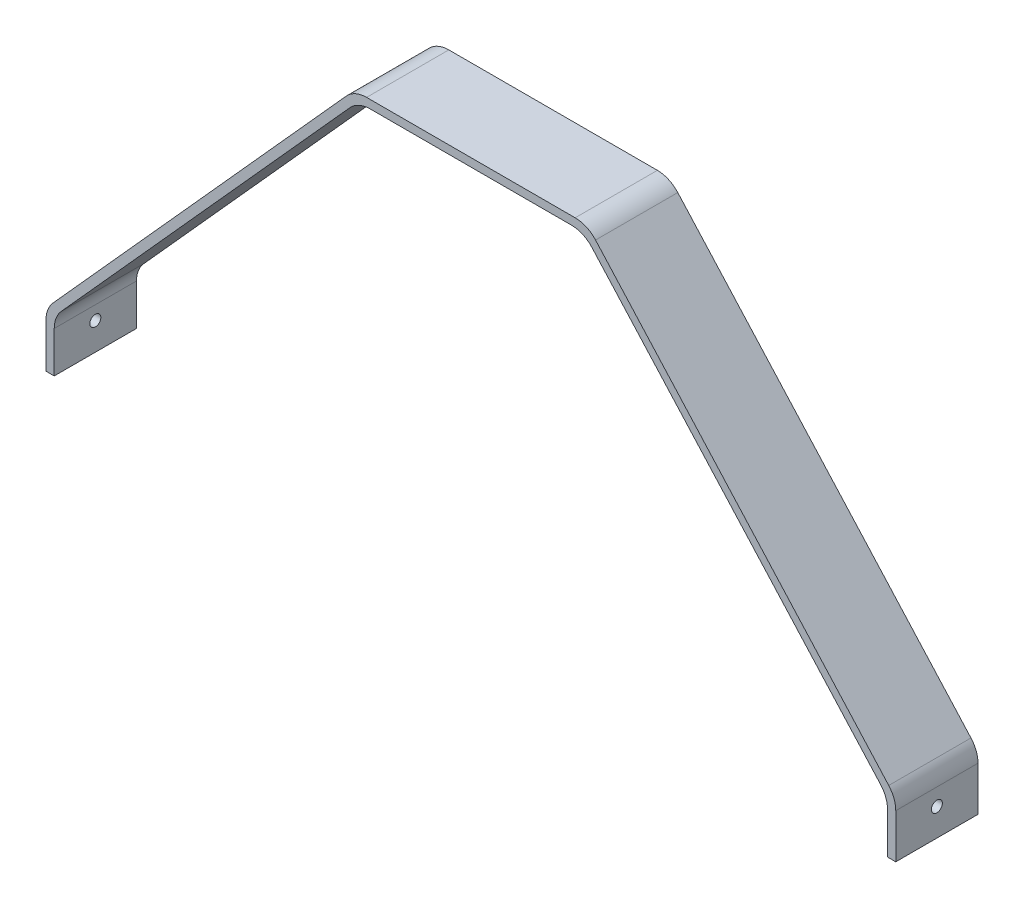
ISO-10303-21;
HEADER;
FILE_DESCRIPTION(('STEP AP214'),'2;1');
FILE_NAME('part.step','',(''),(''),'','','');
FILE_SCHEMA(('AUTOMOTIVE_DESIGN { 1 0 10303 214 1 1 1 1 }'));
ENDSEC;
DATA;
#1=APPLICATION_CONTEXT('core data for automotive mechanical design processes');
#2=APPLICATION_PROTOCOL_DEFINITION('international standard','automotive_design',2000,#1);
#3=PRODUCT_CONTEXT('',#1,'mechanical');
#4=PRODUCT('Part','Part','',(#3));
#5=PRODUCT_RELATED_PRODUCT_CATEGORY('part','',(#4));
#6=PRODUCT_DEFINITION_FORMATION('','',#4);
#7=PRODUCT_DEFINITION_CONTEXT('part definition',#1,'design');
#8=PRODUCT_DEFINITION('design','',#6,#7);
#9=PRODUCT_DEFINITION_SHAPE('','',#8);
#10=(LENGTH_UNIT() NAMED_UNIT(*) SI_UNIT(.MILLI.,.METRE.));
#11=(NAMED_UNIT(*) PLANE_ANGLE_UNIT() SI_UNIT($,.RADIAN.));
#12=(NAMED_UNIT(*) SI_UNIT($,.STERADIAN.) SOLID_ANGLE_UNIT());
#13=UNCERTAINTY_MEASURE_WITH_UNIT(LENGTH_MEASURE(1.E-05),#10,'distance_accuracy_value','');
#14=(GEOMETRIC_REPRESENTATION_CONTEXT(3) GLOBAL_UNCERTAINTY_ASSIGNED_CONTEXT((#13)) GLOBAL_UNIT_ASSIGNED_CONTEXT((#10,
#11,#12)) REPRESENTATION_CONTEXT('',''));
#15=CARTESIAN_POINT('',(0.,0.,0.));
#16=DIRECTION('',(0.,0.,1.));
#17=DIRECTION('',(1.,0.,0.));
#18=AXIS2_PLACEMENT_3D('',#15,#16,#17);
#19=CARTESIAN_POINT('',(0.,-145.,30.));
#20=DIRECTION('',(0.,-1.,0.));
#21=DIRECTION('',(0.,0.,-1.));
#22=AXIS2_PLACEMENT_3D('',#19,#20,#21);
#23=PLANE('',#22);
#24=DIRECTION('',(-1.,0.,0.));
#25=VECTOR('',#24,1.);
#26=CARTESIAN_POINT('',(0.,-145.,0.));
#27=LINE('',#26,#25);
#28=CARTESIAN_POINT('',(155.,-145.,0.));
#29=VERTEX_POINT('',#28);
#30=CARTESIAN_POINT('',(152.,-145.,0.));
#31=VERTEX_POINT('',#30);
#32=EDGE_CURVE('E184',#29,#31,#27,.T.);
#33=ORIENTED_EDGE('',*,*,#32,.F.);
#34=DIRECTION('',(0.,0.,-1.));
#35=VECTOR('',#34,1.);
#36=CARTESIAN_POINT('',(155.,-145.,30.));
#37=LINE('',#36,#35);
#38=CARTESIAN_POINT('',(155.,-145.,30.));
#39=VERTEX_POINT('',#38);
#40=EDGE_CURVE('E178',#39,#29,#37,.T.);
#41=ORIENTED_EDGE('',*,*,#40,.F.);
#42=DIRECTION('',(-1.,0.,0.));
#43=VECTOR('',#42,1.);
#44=CARTESIAN_POINT('',(0.,-145.,30.));
#45=LINE('',#44,#43);
#46=CARTESIAN_POINT('',(152.,-145.,30.));
#47=VERTEX_POINT('',#46);
#48=EDGE_CURVE('E181',#39,#47,#45,.T.);
#49=ORIENTED_EDGE('',*,*,#48,.T.);
#50=DIRECTION('',(0.,0.,-1.));
#51=VECTOR('',#50,1.);
#52=CARTESIAN_POINT('',(152.,-145.,30.));
#53=LINE('',#52,#51);
#54=EDGE_CURVE('E236',#47,#31,#53,.T.);
#55=ORIENTED_EDGE('',*,*,#54,.T.);
#56=EDGE_LOOP('',(#33,#41,#49,#55));
#57=FACE_BOUND('',#56,.T.);
#58=ADVANCED_FACE('F39',(#57),#23,.T.);
#59=CARTESIAN_POINT('',(155.,0.,30.));
#60=DIRECTION('',(-1.,0.,0.));
#61=DIRECTION('',(0.,0.,1.));
#62=AXIS2_PLACEMENT_3D('',#59,#60,#61);
#63=PLANE('',#62);
#64=CARTESIAN_POINT('',(155.,-135.,15.));
#65=DIRECTION('',(1.,0.,0.));
#66=DIRECTION('',(0.,0.,-1.));
#67=AXIS2_PLACEMENT_3D('',#64,#65,#66);
#68=CIRCLE('',#67,2.);
#69=CARTESIAN_POINT('',(155.,-135.,13.));
#70=VERTEX_POINT('',#69);
#71=EDGE_CURVE('E464',#70,#70,#68,.T.);
#72=ORIENTED_EDGE('',*,*,#71,.F.);
#73=EDGE_LOOP('',(#72));
#74=FACE_BOUND('',#73,.T.);
#75=DIRECTION('',(0.,1.,0.));
#76=VECTOR('',#75,1.);
#77=CARTESIAN_POINT('',(155.,0.,0.));
#78=LINE('',#77,#76);
#79=CARTESIAN_POINT('',(155.,-128.837360052304,0.));
#80=VERTEX_POINT('',#79);
#81=EDGE_CURVE('E238',#29,#80,#78,.T.);
#82=ORIENTED_EDGE('',*,*,#81,.T.);
#83=DIRECTION('',(0.,0.,-1.));
#84=VECTOR('',#83,1.);
#85=CARTESIAN_POINT('',(155.,-128.837360052304,30.));
#86=LINE('',#85,#84);
#87=CARTESIAN_POINT('',(155.,-128.837360052304,30.));
#88=VERTEX_POINT('',#87);
#89=EDGE_CURVE('E195',#80,#88,#86,.F.);
#90=ORIENTED_EDGE('',*,*,#89,.T.);
#91=DIRECTION('',(0.,1.,0.));
#92=VECTOR('',#91,1.);
#93=CARTESIAN_POINT('',(155.,0.,30.));
#94=LINE('',#93,#92);
#95=EDGE_CURVE('E192',#39,#88,#94,.T.);
#96=ORIENTED_EDGE('',*,*,#95,.F.);
#97=ORIENTED_EDGE('',*,*,#40,.T.);
#98=EDGE_LOOP('',(#82,#90,#96,#97));
#99=FACE_BOUND('',#98,.T.);
#100=ADVANCED_FACE('F193',(#74,#99),#63,.F.);
#101=CARTESIAN_POINT('',(23.4806629834254,21.1325966850829,30.));
#102=DIRECTION('',(0.743294146247166,0.66896473162245,0.));
#103=DIRECTION('',(-0.66896473162245,0.743294146247166,0.));
#104=AXIS2_PLACEMENT_3D('',#101,#102,#103);
#105=PLANE('',#104);
#106=DIRECTION('',(0.66896473162245,-0.743294146247166,0.));
#107=VECTOR('',#106,1.);
#108=CARTESIAN_POINT('',(23.4806629834254,21.1325966850829,0.));
#109=LINE('',#108,#107);
#110=CARTESIAN_POINT('',(45.479317415398,-3.31035268377549,0.));
#111=VERTEX_POINT('',#110);
#112=CARTESIAN_POINT('',(152.432941462472,-122.14771273608,0.));
#113=VERTEX_POINT('',#112);
#114=EDGE_CURVE('E240',#111,#113,#109,.T.);
#115=ORIENTED_EDGE('',*,*,#114,.F.);
#116=DIRECTION('',(0.,0.,-1.));
#117=VECTOR('',#116,1.);
#118=CARTESIAN_POINT('',(45.479317415398,-3.31035268377548,30.));
#119=LINE('',#118,#117);
#120=CARTESIAN_POINT('',(45.479317415398,-3.31035268377549,30.));
#121=VERTEX_POINT('',#120);
#122=EDGE_CURVE('E319',#111,#121,#119,.F.);
#123=ORIENTED_EDGE('',*,*,#122,.T.);
#124=DIRECTION('',(0.66896473162245,-0.743294146247166,0.));
#125=VECTOR('',#124,1.);
#126=CARTESIAN_POINT('',(23.4806629834254,21.1325966850829,30.));
#127=LINE('',#126,#125);
#128=CARTESIAN_POINT('',(152.432941462472,-122.14771273608,30.));
#129=VERTEX_POINT('',#128);
#130=EDGE_CURVE('E197',#121,#129,#127,.T.);
#131=ORIENTED_EDGE('',*,*,#130,.T.);
#132=DIRECTION('',(0.,0.,-1.));
#133=VECTOR('',#132,1.);
#134=CARTESIAN_POINT('',(152.432941462472,-122.14771273608,0.));
#135=LINE('',#134,#133);
#136=EDGE_CURVE('E316',#129,#113,#135,.T.);
#137=ORIENTED_EDGE('',*,*,#136,.T.);
#138=EDGE_LOOP('',(#115,#123,#131,#137));
#139=FACE_BOUND('',#138,.T.);
#140=ADVANCED_FACE('F362',(#139),#105,.T.);
#141=CARTESIAN_POINT('',(0.,0.,30.));
#142=DIRECTION('',(0.,1.,0.));
#143=DIRECTION('',(-1.,0.,0.));
#144=AXIS2_PLACEMENT_3D('',#141,#142,#143);
#145=PLANE('',#144);
#146=DIRECTION('',(1.,0.,0.));
#147=VECTOR('',#146,1.);
#148=CARTESIAN_POINT('',(0.,0.,0.));
#149=LINE('',#148,#147);
#150=CARTESIAN_POINT('',(-38.0463759529263,0.,0.));
#151=VERTEX_POINT('',#150);
#152=CARTESIAN_POINT('',(38.0463759529263,0.,0.));
#153=VERTEX_POINT('',#152);
#154=EDGE_CURVE('E243',#151,#153,#149,.T.);
#155=ORIENTED_EDGE('',*,*,#154,.F.);
#156=DIRECTION('',(0.,0.,-1.));
#157=VECTOR('',#156,1.);
#158=CARTESIAN_POINT('',(-38.0463759529263,0.,30.));
#159=LINE('',#158,#157);
#160=CARTESIAN_POINT('',(-38.0463759529263,0.,30.));
#161=VERTEX_POINT('',#160);
#162=EDGE_CURVE('E62',#151,#161,#159,.F.);
#163=ORIENTED_EDGE('',*,*,#162,.T.);
#164=DIRECTION('',(1.,0.,0.));
#165=VECTOR('',#164,1.);
#166=CARTESIAN_POINT('',(0.,0.,30.));
#167=LINE('',#166,#165);
#168=CARTESIAN_POINT('',(38.0463759529263,0.,30.));
#169=VERTEX_POINT('',#168);
#170=EDGE_CURVE('E214',#161,#169,#167,.T.);
#171=ORIENTED_EDGE('',*,*,#170,.T.);
#172=DIRECTION('',(0.,0.,-1.));
#173=VECTOR('',#172,1.);
#174=CARTESIAN_POINT('',(38.0463759529263,0.,30.));
#175=LINE('',#174,#173);
#176=EDGE_CURVE('E312',#169,#153,#175,.T.);
#177=ORIENTED_EDGE('',*,*,#176,.T.);
#178=EDGE_LOOP('',(#155,#163,#171,#177));
#179=FACE_BOUND('',#178,.T.);
#180=ADVANCED_FACE('F367',(#179),#145,.T.);
#181=CARTESIAN_POINT('',(-23.4806629834254,21.1325966850829,30.));
#182=DIRECTION('',(0.743294146247166,-0.66896473162245,0.));
#183=DIRECTION('',(0.66896473162245,0.743294146247166,0.));
#184=AXIS2_PLACEMENT_3D('',#181,#182,#183);
#185=PLANE('',#184);
#186=DIRECTION('',(-0.66896473162245,-0.743294146247166,0.));
#187=VECTOR('',#186,1.);
#188=CARTESIAN_POINT('',(-23.4806629834254,21.1325966850829,0.));
#189=LINE('',#188,#187);
#190=CARTESIAN_POINT('',(-45.479317415398,-3.31035268377551,0.));
#191=VERTEX_POINT('',#190);
#192=CARTESIAN_POINT('',(-152.432941462472,-122.14771273608,0.));
#193=VERTEX_POINT('',#192);
#194=EDGE_CURVE('E246',#191,#193,#189,.T.);
#195=ORIENTED_EDGE('',*,*,#194,.T.);
#196=DIRECTION('',(0.,0.,-1.));
#197=VECTOR('',#196,1.);
#198=CARTESIAN_POINT('',(-152.432941462472,-122.14771273608,30.));
#199=LINE('',#198,#197);
#200=CARTESIAN_POINT('',(-152.432941462472,-122.14771273608,30.));
#201=VERTEX_POINT('',#200);
#202=EDGE_CURVE('E303',#193,#201,#199,.F.);
#203=ORIENTED_EDGE('',*,*,#202,.T.);
#204=DIRECTION('',(-0.66896473162245,-0.743294146247166,0.));
#205=VECTOR('',#204,1.);
#206=CARTESIAN_POINT('',(-23.4806629834254,21.1325966850829,30.));
#207=LINE('',#206,#205);
#208=CARTESIAN_POINT('',(-45.479317415398,-3.31035268377551,30.));
#209=VERTEX_POINT('',#208);
#210=EDGE_CURVE('E216',#209,#201,#207,.T.);
#211=ORIENTED_EDGE('',*,*,#210,.F.);
#212=DIRECTION('',(0.,0.,-1.));
#213=VECTOR('',#212,1.);
#214=CARTESIAN_POINT('',(-45.479317415398,-3.31035268377551,0.));
#215=LINE('',#214,#213);
#216=EDGE_CURVE('E300',#209,#191,#215,.T.);
#217=ORIENTED_EDGE('',*,*,#216,.T.);
#218=EDGE_LOOP('',(#195,#203,#211,#217));
#219=FACE_BOUND('',#218,.T.);
#220=ADVANCED_FACE('F375',(#219),#185,.F.);
#221=CARTESIAN_POINT('',(-155.,0.,30.));
#222=DIRECTION('',(-1.,0.,0.));
#223=DIRECTION('',(0.,0.,1.));
#224=AXIS2_PLACEMENT_3D('',#221,#222,#223);
#225=PLANE('',#224);
#226=CARTESIAN_POINT('',(-155.,-135.,15.));
#227=DIRECTION('',(1.,0.,0.));
#228=DIRECTION('',(0.,0.,-1.));
#229=AXIS2_PLACEMENT_3D('',#226,#227,#228);
#230=CIRCLE('',#229,2.);
#231=CARTESIAN_POINT('',(-155.,-135.,13.));
#232=VERTEX_POINT('',#231);
#233=EDGE_CURVE('E465',#232,#232,#230,.T.);
#234=ORIENTED_EDGE('',*,*,#233,.T.);
#235=EDGE_LOOP('',(#234));
#236=FACE_BOUND('',#235,.T.);
#237=DIRECTION('',(0.,1.,0.));
#238=VECTOR('',#237,1.);
#239=CARTESIAN_POINT('',(-155.,0.,30.));
#240=LINE('',#239,#238);
#241=CARTESIAN_POINT('',(-155.,-145.,30.));
#242=VERTEX_POINT('',#241);
#243=CARTESIAN_POINT('',(-155.,-128.837360052304,30.));
#244=VERTEX_POINT('',#243);
#245=EDGE_CURVE('E218',#242,#244,#240,.T.);
#246=ORIENTED_EDGE('',*,*,#245,.T.);
#247=DIRECTION('',(0.,0.,-1.));
#248=VECTOR('',#247,1.);
#249=CARTESIAN_POINT('',(-155.,-128.837360052304,0.));
#250=LINE('',#249,#248);
#251=CARTESIAN_POINT('',(-155.,-128.837360052304,0.));
#252=VERTEX_POINT('',#251);
#253=EDGE_CURVE('E289',#244,#252,#250,.T.);
#254=ORIENTED_EDGE('',*,*,#253,.T.);
#255=DIRECTION('',(0.,1.,0.));
#256=VECTOR('',#255,1.);
#257=CARTESIAN_POINT('',(-155.,0.,0.));
#258=LINE('',#257,#256);
#259=CARTESIAN_POINT('',(-155.,-145.,0.));
#260=VERTEX_POINT('',#259);
#261=EDGE_CURVE('E249',#260,#252,#258,.T.);
#262=ORIENTED_EDGE('',*,*,#261,.F.);
#263=DIRECTION('',(0.,0.,-1.));
#264=VECTOR('',#263,1.);
#265=CARTESIAN_POINT('',(-155.,-145.,30.));
#266=LINE('',#265,#264);
#267=EDGE_CURVE('E189',#242,#260,#266,.T.);
#268=ORIENTED_EDGE('',*,*,#267,.F.);
#269=EDGE_LOOP('',(#246,#254,#262,#268));
#270=FACE_BOUND('',#269,.T.);
#271=ADVANCED_FACE('F384',(#236,#270),#225,.T.);
#272=CARTESIAN_POINT('',(0.,-145.,30.));
#273=DIRECTION('',(0.,1.,0.));
#274=DIRECTION('',(0.,0.,1.));
#275=AXIS2_PLACEMENT_3D('',#272,#273,#274);
#276=PLANE('',#275);
#277=DIRECTION('',(1.,0.,0.));
#278=VECTOR('',#277,1.);
#279=CARTESIAN_POINT('',(0.,-145.,0.));
#280=LINE('',#279,#278);
#281=CARTESIAN_POINT('',(-152.,-145.,0.));
#282=VERTEX_POINT('',#281);
#283=EDGE_CURVE('E252',#260,#282,#280,.T.);
#284=ORIENTED_EDGE('',*,*,#283,.T.);
#285=DIRECTION('',(0.,0.,-1.));
#286=VECTOR('',#285,1.);
#287=CARTESIAN_POINT('',(-152.,-145.,30.));
#288=LINE('',#287,#286);
#289=CARTESIAN_POINT('',(-152.,-145.,30.));
#290=VERTEX_POINT('',#289);
#291=EDGE_CURVE('E266',#290,#282,#288,.T.);
#292=ORIENTED_EDGE('',*,*,#291,.F.);
#293=DIRECTION('',(1.,0.,0.));
#294=VECTOR('',#293,1.);
#295=CARTESIAN_POINT('',(0.,-145.,30.));
#296=LINE('',#295,#294);
#297=EDGE_CURVE('E221',#242,#290,#296,.T.);
#298=ORIENTED_EDGE('',*,*,#297,.F.);
#299=ORIENTED_EDGE('',*,*,#267,.T.);
#300=EDGE_LOOP('',(#284,#292,#298,#299));
#301=FACE_BOUND('',#300,.T.);
#302=ADVANCED_FACE('F389',(#301),#276,.F.);
#303=CARTESIAN_POINT('',(-152.,0.,30.));
#304=DIRECTION('',(-1.,0.,0.));
#305=DIRECTION('',(0.,0.,1.));
#306=AXIS2_PLACEMENT_3D('',#303,#304,#305);
#307=PLANE('',#306);
#308=CARTESIAN_POINT('',(-152.,-135.,15.));
#309=DIRECTION('',(-1.,0.,0.));
#310=DIRECTION('',(0.,0.,1.));
#311=AXIS2_PLACEMENT_3D('',#308,#309,#310);
#312=CIRCLE('',#311,2.);
#313=CARTESIAN_POINT('',(-152.,-135.,17.));
#314=VERTEX_POINT('',#313);
#315=EDGE_CURVE('E209',#314,#314,#312,.T.);
#316=ORIENTED_EDGE('',*,*,#315,.T.);
#317=EDGE_LOOP('',(#316));
#318=FACE_BOUND('',#317,.T.);
#319=DIRECTION('',(0.,1.,0.));
#320=VECTOR('',#319,1.);
#321=CARTESIAN_POINT('',(-152.,0.,0.));
#322=LINE('',#321,#320);
#323=CARTESIAN_POINT('',(-152.,-129.988568067995,0.));
#324=VERTEX_POINT('',#323);
#325=EDGE_CURVE('E254',#282,#324,#322,.T.);
#326=ORIENTED_EDGE('',*,*,#325,.T.);
#327=DIRECTION('',(0.,0.,-1.));
#328=VECTOR('',#327,1.);
#329=CARTESIAN_POINT('',(-152.,-129.988568067995,30.));
#330=LINE('',#329,#328);
#331=CARTESIAN_POINT('',(-152.,-129.988568067995,30.));
#332=VERTEX_POINT('',#331);
#333=EDGE_CURVE('E274',#324,#332,#330,.F.);
#334=ORIENTED_EDGE('',*,*,#333,.T.);
#335=DIRECTION('',(0.,1.,0.));
#336=VECTOR('',#335,1.);
#337=CARTESIAN_POINT('',(-152.,0.,30.));
#338=LINE('',#337,#336);
#339=EDGE_CURVE('E223',#290,#332,#338,.T.);
#340=ORIENTED_EDGE('',*,*,#339,.F.);
#341=ORIENTED_EDGE('',*,*,#291,.T.);
#342=EDGE_LOOP('',(#326,#334,#340,#341));
#343=FACE_BOUND('',#342,.T.);
#344=ADVANCED_FACE('F393',(#318,#343),#307,.F.);
#345=CARTESIAN_POINT('',(-21.2507805446839,19.1257024902155,30.));
#346=DIRECTION('',(0.743294146247166,-0.66896473162245,0.));
#347=DIRECTION('',(0.66896473162245,0.743294146247166,0.));
#348=AXIS2_PLACEMENT_3D('',#345,#346,#347);
#349=PLANE('',#348);
#350=DIRECTION('',(-0.66896473162245,-0.743294146247166,0.));
#351=VECTOR('',#350,1.);
#352=CARTESIAN_POINT('',(-21.2507805446839,19.1257024902155,30.));
#353=LINE('',#352,#351);
#354=CARTESIAN_POINT('',(-44.1432302012758,-6.31035268377551,30.));
#355=VERTEX_POINT('',#354);
#356=CARTESIAN_POINT('',(-149.432941462472,-123.298920751771,30.));
#357=VERTEX_POINT('',#356);
#358=EDGE_CURVE('E226',#355,#357,#353,.T.);
#359=ORIENTED_EDGE('',*,*,#358,.T.);
#360=DIRECTION('',(0.,0.,-1.));
#361=VECTOR('',#360,1.);
#362=CARTESIAN_POINT('',(-149.432941462472,-123.298920751771,30.));
#363=LINE('',#362,#361);
#364=CARTESIAN_POINT('',(-149.432941462472,-123.298920751771,0.));
#365=VERTEX_POINT('',#364);
#366=EDGE_CURVE('E271',#357,#365,#363,.T.);
#367=ORIENTED_EDGE('',*,*,#366,.T.);
#368=DIRECTION('',(-0.66896473162245,-0.743294146247166,0.));
#369=VECTOR('',#368,1.);
#370=CARTESIAN_POINT('',(-21.2507805446839,19.1257024902155,0.));
#371=LINE('',#370,#369);
#372=CARTESIAN_POINT('',(-44.1432302012758,-6.31035268377551,0.));
#373=VERTEX_POINT('',#372);
#374=EDGE_CURVE('E257',#373,#365,#371,.T.);
#375=ORIENTED_EDGE('',*,*,#374,.F.);
#376=DIRECTION('',(0.,0.,-1.));
#377=VECTOR('',#376,1.);
#378=CARTESIAN_POINT('',(-44.1432302012758,-6.31035268377551,30.));
#379=LINE('',#378,#377);
#380=EDGE_CURVE('E188',#373,#355,#379,.F.);
#381=ORIENTED_EDGE('',*,*,#380,.T.);
#382=EDGE_LOOP('',(#359,#367,#375,#381));
#383=FACE_BOUND('',#382,.T.);
#384=ADVANCED_FACE('F402',(#383),#349,.T.);
#385=CARTESIAN_POINT('',(0.,-3.,30.));
#386=DIRECTION('',(0.,1.,0.));
#387=DIRECTION('',(0.,0.,1.));
#388=AXIS2_PLACEMENT_3D('',#385,#386,#387);
#389=PLANE('',#388);
#390=DIRECTION('',(1.,0.,0.));
#391=VECTOR('',#390,1.);
#392=CARTESIAN_POINT('',(0.,-3.,30.));
#393=LINE('',#392,#391);
#394=CARTESIAN_POINT('',(-36.7102887388042,-3.,30.));
#395=VERTEX_POINT('',#394);
#396=CARTESIAN_POINT('',(36.7102887388042,-3.,30.));
#397=VERTEX_POINT('',#396);
#398=EDGE_CURVE('E229',#395,#397,#393,.T.);
#399=ORIENTED_EDGE('',*,*,#398,.F.);
#400=DIRECTION('',(0.,0.,-1.));
#401=VECTOR('',#400,1.);
#402=CARTESIAN_POINT('',(-36.7102887388042,-3.,30.));
#403=LINE('',#402,#401);
#404=CARTESIAN_POINT('',(-36.7102887388042,-3.,0.));
#405=VERTEX_POINT('',#404);
#406=EDGE_CURVE('E278',#395,#405,#403,.T.);
#407=ORIENTED_EDGE('',*,*,#406,.T.);
#408=DIRECTION('',(1.,0.,0.));
#409=VECTOR('',#408,1.);
#410=CARTESIAN_POINT('',(0.,-3.,0.));
#411=LINE('',#410,#409);
#412=CARTESIAN_POINT('',(36.7102887388042,-3.,0.));
#413=VERTEX_POINT('',#412);
#414=EDGE_CURVE('E260',#405,#413,#411,.T.);
#415=ORIENTED_EDGE('',*,*,#414,.T.);
#416=DIRECTION('',(0.,0.,-1.));
#417=VECTOR('',#416,1.);
#418=CARTESIAN_POINT('',(36.7102887388042,-3.,30.));
#419=LINE('',#418,#417);
#420=EDGE_CURVE('E276',#413,#397,#419,.F.);
#421=ORIENTED_EDGE('',*,*,#420,.T.);
#422=EDGE_LOOP('',(#399,#407,#415,#421));
#423=FACE_BOUND('',#422,.T.);
#424=ADVANCED_FACE('F343',(#423),#389,.F.);
#425=CARTESIAN_POINT('',(21.2507805446839,19.1257024902155,30.));
#426=DIRECTION('',(0.743294146247166,0.66896473162245,0.));
#427=DIRECTION('',(-0.66896473162245,0.743294146247166,0.));
#428=AXIS2_PLACEMENT_3D('',#425,#426,#427);
#429=PLANE('',#428);
#430=DIRECTION('',(0.66896473162245,-0.743294146247166,0.));
#431=VECTOR('',#430,1.);
#432=CARTESIAN_POINT('',(21.2507805446839,19.1257024902155,0.));
#433=LINE('',#432,#431);
#434=CARTESIAN_POINT('',(44.1432302012758,-6.3103526837755,0.));
#435=VERTEX_POINT('',#434);
#436=CARTESIAN_POINT('',(149.432941462472,-123.298920751771,0.));
#437=VERTEX_POINT('',#436);
#438=EDGE_CURVE('E206',#435,#437,#433,.T.);
#439=ORIENTED_EDGE('',*,*,#438,.T.);
#440=DIRECTION('',(0.,0.,-1.));
#441=VECTOR('',#440,1.);
#442=CARTESIAN_POINT('',(149.432941462472,-123.298920751771,30.));
#443=LINE('',#442,#441);
#444=CARTESIAN_POINT('',(149.432941462472,-123.298920751771,30.));
#445=VERTEX_POINT('',#444);
#446=EDGE_CURVE('E287',#437,#445,#443,.F.);
#447=ORIENTED_EDGE('',*,*,#446,.T.);
#448=DIRECTION('',(0.66896473162245,-0.743294146247166,0.));
#449=VECTOR('',#448,1.);
#450=CARTESIAN_POINT('',(21.2507805446839,19.1257024902155,30.));
#451=LINE('',#450,#449);
#452=CARTESIAN_POINT('',(44.1432302012758,-6.3103526837755,30.));
#453=VERTEX_POINT('',#452);
#454=EDGE_CURVE('E232',#453,#445,#451,.T.);
#455=ORIENTED_EDGE('',*,*,#454,.F.);
#456=DIRECTION('',(0.,0.,-1.));
#457=VECTOR('',#456,1.);
#458=CARTESIAN_POINT('',(44.1432302012759,-6.3103526837755,0.));
#459=LINE('',#458,#457);
#460=EDGE_CURVE('E284',#453,#435,#459,.T.);
#461=ORIENTED_EDGE('',*,*,#460,.T.);
#462=EDGE_LOOP('',(#439,#447,#455,#461));
#463=FACE_BOUND('',#462,.T.);
#464=ADVANCED_FACE('F350',(#463),#429,.F.);
#465=CARTESIAN_POINT('',(152.,0.,30.));
#466=DIRECTION('',(-1.,0.,0.));
#467=DIRECTION('',(0.,0.,1.));
#468=AXIS2_PLACEMENT_3D('',#465,#466,#467);
#469=PLANE('',#468);
#470=CARTESIAN_POINT('',(152.,-135.,15.));
#471=DIRECTION('',(-1.,0.,0.));
#472=DIRECTION('',(0.,0.,1.));
#473=AXIS2_PLACEMENT_3D('',#470,#471,#472);
#474=CIRCLE('',#473,2.);
#475=CARTESIAN_POINT('',(152.,-135.,17.));
#476=VERTEX_POINT('',#475);
#477=EDGE_CURVE('E43',#476,#476,#474,.T.);
#478=ORIENTED_EDGE('',*,*,#477,.F.);
#479=EDGE_LOOP('',(#478));
#480=FACE_BOUND('',#479,.T.);
#481=DIRECTION('',(0.,1.,0.));
#482=VECTOR('',#481,1.);
#483=CARTESIAN_POINT('',(152.,0.,30.));
#484=LINE('',#483,#482);
#485=CARTESIAN_POINT('',(152.,-129.988568067995,30.));
#486=VERTEX_POINT('',#485);
#487=EDGE_CURVE('E202',#47,#486,#484,.T.);
#488=ORIENTED_EDGE('',*,*,#487,.T.);
#489=DIRECTION('',(0.,0.,-1.));
#490=VECTOR('',#489,1.);
#491=CARTESIAN_POINT('',(152.,-129.988568067995,30.));
#492=LINE('',#491,#490);
#493=CARTESIAN_POINT('',(152.,-129.988568067995,0.));
#494=VERTEX_POINT('',#493);
#495=EDGE_CURVE('E281',#486,#494,#492,.T.);
#496=ORIENTED_EDGE('',*,*,#495,.T.);
#497=DIRECTION('',(0.,1.,0.));
#498=VECTOR('',#497,1.);
#499=CARTESIAN_POINT('',(152.,0.,0.));
#500=LINE('',#499,#498);
#501=EDGE_CURVE('E203',#31,#494,#500,.T.);
#502=ORIENTED_EDGE('',*,*,#501,.F.);
#503=ORIENTED_EDGE('',*,*,#54,.F.);
#504=EDGE_LOOP('',(#488,#496,#502,#503));
#505=FACE_BOUND('',#504,.T.);
#506=ADVANCED_FACE('F356',(#480,#505),#469,.T.);
#507=CARTESIAN_POINT('',(0.,0.,30.));
#508=DIRECTION('',(0.,0.,1.));
#509=DIRECTION('',(1.,0.,0.));
#510=AXIS2_PLACEMENT_3D('',#507,#508,#509);
#511=PLANE('',#510);
#512=ORIENTED_EDGE('',*,*,#210,.T.);
#513=CARTESIAN_POINT('',(-145.,-128.837360052304,30.));
#514=DIRECTION('',(0.,0.,1.));
#515=DIRECTION('',(1.,0.,0.));
#516=AXIS2_PLACEMENT_3D('',#513,#514,#515);
#517=CIRCLE('',#516,10.);
#518=EDGE_CURVE('E310',#201,#244,#517,.T.);
#519=ORIENTED_EDGE('',*,*,#518,.T.);
#520=ORIENTED_EDGE('',*,*,#245,.F.);
#521=ORIENTED_EDGE('',*,*,#297,.T.);
#522=ORIENTED_EDGE('',*,*,#339,.T.);
#523=CARTESIAN_POINT('',(-142.,-129.988568067995,30.));
#524=DIRECTION('',(0.,0.,1.));
#525=DIRECTION('',(1.,0.,0.));
#526=AXIS2_PLACEMENT_3D('',#523,#524,#525);
#527=CIRCLE('',#526,10.);
#528=EDGE_CURVE('E324',#332,#357,#527,.F.);
#529=ORIENTED_EDGE('',*,*,#528,.T.);
#530=ORIENTED_EDGE('',*,*,#358,.F.);
#531=CARTESIAN_POINT('',(-36.7102887388042,-13.,30.));
#532=DIRECTION('',(0.,0.,1.));
#533=DIRECTION('',(1.,0.,0.));
#534=AXIS2_PLACEMENT_3D('',#531,#532,#533);
#535=CIRCLE('',#534,10.);
#536=EDGE_CURVE('E328',#355,#395,#535,.F.);
#537=ORIENTED_EDGE('',*,*,#536,.T.);
#538=ORIENTED_EDGE('',*,*,#398,.T.);
#539=CARTESIAN_POINT('',(36.7102887388042,-13.,30.));
#540=DIRECTION('',(0.,0.,1.));
#541=DIRECTION('',(1.,0.,0.));
#542=AXIS2_PLACEMENT_3D('',#539,#540,#541);
#543=CIRCLE('',#542,10.);
#544=EDGE_CURVE('E11',#397,#453,#543,.F.);
#545=ORIENTED_EDGE('',*,*,#544,.T.);
#546=ORIENTED_EDGE('',*,*,#454,.T.);
#547=CARTESIAN_POINT('',(142.,-129.988568067995,30.));
#548=DIRECTION('',(0.,0.,1.));
#549=DIRECTION('',(1.,0.,0.));
#550=AXIS2_PLACEMENT_3D('',#547,#548,#549);
#551=CIRCLE('',#550,10.);
#552=EDGE_CURVE('E332',#445,#486,#551,.F.);
#553=ORIENTED_EDGE('',*,*,#552,.T.);
#554=ORIENTED_EDGE('',*,*,#487,.F.);
#555=ORIENTED_EDGE('',*,*,#48,.F.);
#556=ORIENTED_EDGE('',*,*,#95,.T.);
#557=CARTESIAN_POINT('',(145.,-128.837360052304,30.));
#558=DIRECTION('',(0.,0.,1.));
#559=DIRECTION('',(1.,0.,0.));
#560=AXIS2_PLACEMENT_3D('',#557,#558,#559);
#561=CIRCLE('',#560,10.);
#562=EDGE_CURVE('E305',#88,#129,#561,.T.);
#563=ORIENTED_EDGE('',*,*,#562,.T.);
#564=ORIENTED_EDGE('',*,*,#130,.F.);
#565=CARTESIAN_POINT('',(38.0463759529263,-9.99999999999998,30.));
#566=DIRECTION('',(0.,0.,1.));
#567=DIRECTION('',(1.,0.,0.));
#568=AXIS2_PLACEMENT_3D('',#565,#566,#567);
#569=CIRCLE('',#568,10.);
#570=EDGE_CURVE('E55',#121,#169,#569,.T.);
#571=ORIENTED_EDGE('',*,*,#570,.T.);
#572=ORIENTED_EDGE('',*,*,#170,.F.);
#573=CARTESIAN_POINT('',(-38.0463759529263,-10.,30.));
#574=DIRECTION('',(0.,0.,1.));
#575=DIRECTION('',(1.,0.,0.));
#576=AXIS2_PLACEMENT_3D('',#573,#574,#575);
#577=CIRCLE('',#576,10.);
#578=EDGE_CURVE('E308',#161,#209,#577,.T.);
#579=ORIENTED_EDGE('',*,*,#578,.T.);
#580=EDGE_LOOP('',(#512,#519,#520,#521,#522,#529,#530,#537,#538,#545,#546,#553,#554,#555,#556,
#563,#564,#571,#572,#579));
#581=FACE_BOUND('',#580,.T.);
#582=ADVANCED_FACE('F200',(#581),#511,.T.);
#583=CARTESIAN_POINT('',(0.,0.,0.));
#584=DIRECTION('',(0.,0.,1.));
#585=DIRECTION('',(1.,0.,0.));
#586=AXIS2_PLACEMENT_3D('',#583,#584,#585);
#587=PLANE('',#586);
#588=ORIENTED_EDGE('',*,*,#261,.T.);
#589=CARTESIAN_POINT('',(-145.,-128.837360052304,0.));
#590=DIRECTION('',(0.,0.,1.));
#591=DIRECTION('',(1.,0.,0.));
#592=AXIS2_PLACEMENT_3D('',#589,#590,#591);
#593=CIRCLE('',#592,10.);
#594=EDGE_CURVE('E298',#252,#193,#593,.F.);
#595=ORIENTED_EDGE('',*,*,#594,.T.);
#596=ORIENTED_EDGE('',*,*,#194,.F.);
#597=CARTESIAN_POINT('',(-38.0463759529263,-10.,0.));
#598=DIRECTION('',(0.,0.,1.));
#599=DIRECTION('',(1.,0.,0.));
#600=AXIS2_PLACEMENT_3D('',#597,#598,#599);
#601=CIRCLE('',#600,10.);
#602=EDGE_CURVE('E296',#191,#151,#601,.F.);
#603=ORIENTED_EDGE('',*,*,#602,.T.);
#604=ORIENTED_EDGE('',*,*,#154,.T.);
#605=CARTESIAN_POINT('',(38.0463759529263,-9.99999999999998,0.));
#606=DIRECTION('',(0.,0.,1.));
#607=DIRECTION('',(1.,0.,0.));
#608=AXIS2_PLACEMENT_3D('',#605,#606,#607);
#609=CIRCLE('',#608,10.);
#610=EDGE_CURVE('E294',#153,#111,#609,.F.);
#611=ORIENTED_EDGE('',*,*,#610,.T.);
#612=ORIENTED_EDGE('',*,*,#114,.T.);
#613=CARTESIAN_POINT('',(145.,-128.837360052304,0.));
#614=DIRECTION('',(0.,0.,1.));
#615=DIRECTION('',(1.,0.,0.));
#616=AXIS2_PLACEMENT_3D('',#613,#614,#615);
#617=CIRCLE('',#616,10.);
#618=EDGE_CURVE('E292',#113,#80,#617,.F.);
#619=ORIENTED_EDGE('',*,*,#618,.T.);
#620=ORIENTED_EDGE('',*,*,#81,.F.);
#621=ORIENTED_EDGE('',*,*,#32,.T.);
#622=ORIENTED_EDGE('',*,*,#501,.T.);
#623=CARTESIAN_POINT('',(142.,-129.988568067995,0.));
#624=DIRECTION('',(0.,0.,1.));
#625=DIRECTION('',(1.,0.,0.));
#626=AXIS2_PLACEMENT_3D('',#623,#624,#625);
#627=CIRCLE('',#626,10.);
#628=EDGE_CURVE('E330',#494,#437,#627,.T.);
#629=ORIENTED_EDGE('',*,*,#628,.T.);
#630=ORIENTED_EDGE('',*,*,#438,.F.);
#631=CARTESIAN_POINT('',(36.7102887388042,-13.,0.));
#632=DIRECTION('',(0.,0.,1.));
#633=DIRECTION('',(1.,0.,0.));
#634=AXIS2_PLACEMENT_3D('',#631,#632,#633);
#635=CIRCLE('',#634,10.);
#636=EDGE_CURVE('E48',#435,#413,#635,.T.);
#637=ORIENTED_EDGE('',*,*,#636,.T.);
#638=ORIENTED_EDGE('',*,*,#414,.F.);
#639=CARTESIAN_POINT('',(-36.7102887388042,-13.,0.));
#640=DIRECTION('',(0.,0.,1.));
#641=DIRECTION('',(1.,0.,0.));
#642=AXIS2_PLACEMENT_3D('',#639,#640,#641);
#643=CIRCLE('',#642,10.);
#644=EDGE_CURVE('E326',#405,#373,#643,.T.);
#645=ORIENTED_EDGE('',*,*,#644,.T.);
#646=ORIENTED_EDGE('',*,*,#374,.T.);
#647=CARTESIAN_POINT('',(-142.,-129.988568067995,0.));
#648=DIRECTION('',(0.,0.,1.));
#649=DIRECTION('',(1.,0.,0.));
#650=AXIS2_PLACEMENT_3D('',#647,#648,#649);
#651=CIRCLE('',#650,10.);
#652=EDGE_CURVE('E322',#365,#324,#651,.T.);
#653=ORIENTED_EDGE('',*,*,#652,.T.);
#654=ORIENTED_EDGE('',*,*,#325,.F.);
#655=ORIENTED_EDGE('',*,*,#283,.F.);
#656=EDGE_LOOP('',(#588,#595,#596,#603,#604,#611,#612,#619,#620,#621,#622,#629,#630,#637,#638,
#645,#646,#653,#654,#655));
#657=FACE_BOUND('',#656,.T.);
#658=ADVANCED_FACE('F337',(#657),#587,.F.);
#659=CARTESIAN_POINT('',(-142.,-129.988568067995,30.));
#660=DIRECTION('',(0.,0.,-1.));
#661=DIRECTION('',(-1.,0.,0.));
#662=AXIS2_PLACEMENT_3D('',#659,#660,#661);
#663=CYLINDRICAL_SURFACE('',#662,10.);
#664=ORIENTED_EDGE('',*,*,#528,.F.);
#665=ORIENTED_EDGE('',*,*,#333,.F.);
#666=ORIENTED_EDGE('',*,*,#652,.F.);
#667=ORIENTED_EDGE('',*,*,#366,.F.);
#668=EDGE_LOOP('',(#664,#665,#666,#667));
#669=FACE_BOUND('',#668,.T.);
#670=ADVANCED_FACE('F399',(#669),#663,.F.);
#671=CARTESIAN_POINT('',(-36.7102887388042,-13.,30.));
#672=DIRECTION('',(0.,0.,-1.));
#673=DIRECTION('',(-1.,0.,0.));
#674=AXIS2_PLACEMENT_3D('',#671,#672,#673);
#675=CYLINDRICAL_SURFACE('',#674,10.);
#676=ORIENTED_EDGE('',*,*,#536,.F.);
#677=ORIENTED_EDGE('',*,*,#380,.F.);
#678=ORIENTED_EDGE('',*,*,#644,.F.);
#679=ORIENTED_EDGE('',*,*,#406,.F.);
#680=EDGE_LOOP('',(#676,#677,#678,#679));
#681=FACE_BOUND('',#680,.T.);
#682=ADVANCED_FACE('F406',(#681),#675,.F.);
#683=CARTESIAN_POINT('',(142.,-129.988568067995,30.));
#684=DIRECTION('',(0.,0.,-1.));
#685=DIRECTION('',(-1.,0.,0.));
#686=AXIS2_PLACEMENT_3D('',#683,#684,#685);
#687=CYLINDRICAL_SURFACE('',#686,10.);
#688=ORIENTED_EDGE('',*,*,#552,.F.);
#689=ORIENTED_EDGE('',*,*,#446,.F.);
#690=ORIENTED_EDGE('',*,*,#628,.F.);
#691=ORIENTED_EDGE('',*,*,#495,.F.);
#692=EDGE_LOOP('',(#688,#689,#690,#691));
#693=FACE_BOUND('',#692,.T.);
#694=ADVANCED_FACE('F353',(#693),#687,.F.);
#695=CARTESIAN_POINT('',(36.7102887388042,-13.,30.));
#696=DIRECTION('',(0.,0.,1.));
#697=DIRECTION('',(1.,0.,0.));
#698=AXIS2_PLACEMENT_3D('',#695,#696,#697);
#699=CYLINDRICAL_SURFACE('',#698,10.);
#700=ORIENTED_EDGE('',*,*,#544,.F.);
#701=ORIENTED_EDGE('',*,*,#420,.F.);
#702=ORIENTED_EDGE('',*,*,#636,.F.);
#703=ORIENTED_EDGE('',*,*,#460,.F.);
#704=EDGE_LOOP('',(#700,#701,#702,#703));
#705=FACE_BOUND('',#704,.T.);
#706=ADVANCED_FACE('F346',(#705),#699,.F.);
#707=CARTESIAN_POINT('',(-145.,-128.837360052304,30.));
#708=DIRECTION('',(0.,0.,1.));
#709=DIRECTION('',(1.,0.,0.));
#710=AXIS2_PLACEMENT_3D('',#707,#708,#709);
#711=CYLINDRICAL_SURFACE('',#710,10.);
#712=ORIENTED_EDGE('',*,*,#518,.F.);
#713=ORIENTED_EDGE('',*,*,#202,.F.);
#714=ORIENTED_EDGE('',*,*,#594,.F.);
#715=ORIENTED_EDGE('',*,*,#253,.F.);
#716=EDGE_LOOP('',(#712,#713,#714,#715));
#717=FACE_BOUND('',#716,.T.);
#718=ADVANCED_FACE('F381',(#717),#711,.T.);
#719=CARTESIAN_POINT('',(-38.0463759529263,-10.,30.));
#720=DIRECTION('',(0.,0.,1.));
#721=DIRECTION('',(1.,0.,0.));
#722=AXIS2_PLACEMENT_3D('',#719,#720,#721);
#723=CYLINDRICAL_SURFACE('',#722,10.);
#724=ORIENTED_EDGE('',*,*,#578,.F.);
#725=ORIENTED_EDGE('',*,*,#162,.F.);
#726=ORIENTED_EDGE('',*,*,#602,.F.);
#727=ORIENTED_EDGE('',*,*,#216,.F.);
#728=EDGE_LOOP('',(#724,#725,#726,#727));
#729=FACE_BOUND('',#728,.T.);
#730=ADVANCED_FACE('F372',(#729),#723,.T.);
#731=CARTESIAN_POINT('',(38.0463759529263,-9.99999999999998,30.));
#732=DIRECTION('',(0.,0.,-1.));
#733=DIRECTION('',(-1.,0.,0.));
#734=AXIS2_PLACEMENT_3D('',#731,#732,#733);
#735=CYLINDRICAL_SURFACE('',#734,10.);
#736=ORIENTED_EDGE('',*,*,#570,.F.);
#737=ORIENTED_EDGE('',*,*,#122,.F.);
#738=ORIENTED_EDGE('',*,*,#610,.F.);
#739=ORIENTED_EDGE('',*,*,#176,.F.);
#740=EDGE_LOOP('',(#736,#737,#738,#739));
#741=FACE_BOUND('',#740,.T.);
#742=ADVANCED_FACE('F365',(#741),#735,.T.);
#743=CARTESIAN_POINT('',(145.,-128.837360052304,30.));
#744=DIRECTION('',(0.,0.,1.));
#745=DIRECTION('',(1.,0.,0.));
#746=AXIS2_PLACEMENT_3D('',#743,#744,#745);
#747=CYLINDRICAL_SURFACE('',#746,10.);
#748=ORIENTED_EDGE('',*,*,#562,.F.);
#749=ORIENTED_EDGE('',*,*,#89,.F.);
#750=ORIENTED_EDGE('',*,*,#618,.F.);
#751=ORIENTED_EDGE('',*,*,#136,.F.);
#752=EDGE_LOOP('',(#748,#749,#750,#751));
#753=FACE_BOUND('',#752,.T.);
#754=ADVANCED_FACE('F41',(#753),#747,.T.);
#755=CARTESIAN_POINT('',(-155.,-135.,15.));
#756=DIRECTION('',(1.,0.,0.));
#757=DIRECTION('',(0.,0.,-1.));
#758=AXIS2_PLACEMENT_3D('',#755,#756,#757);
#759=CYLINDRICAL_SURFACE('',#758,2.);
#760=ORIENTED_EDGE('',*,*,#477,.T.);
#761=EDGE_LOOP('',(#760));
#762=FACE_BOUND('',#761,.T.);
#763=ORIENTED_EDGE('',*,*,#71,.T.);
#764=EDGE_LOOP('',(#763));
#765=FACE_BOUND('',#764,.T.);
#766=ADVANCED_FACE('F450',(#762,#765),#759,.F.);
#767=ORIENTED_EDGE('',*,*,#233,.F.);
#768=EDGE_LOOP('',(#767));
#769=FACE_BOUND('',#768,.T.);
#770=ORIENTED_EDGE('',*,*,#315,.F.);
#771=EDGE_LOOP('',(#770));
#772=FACE_BOUND('',#771,.T.);
#773=ADVANCED_FACE('F452',(#769,#772),#759,.F.);
#774=CLOSED_SHELL('',(#58,#100,#140,#180,#220,#271,#302,#344,#384,#424,#464,#506,#582,#658,#670,
#682,#694,#706,#718,#730,#742,#754,#766,#773));
#775=MANIFOLD_SOLID_BREP('B2',#774);
#776=ADVANCED_BREP_SHAPE_REPRESENTATION('',(#18,#775),#14);
#777=SHAPE_DEFINITION_REPRESENTATION(#9,#776);
ENDSEC;
END-ISO-10303-21;
